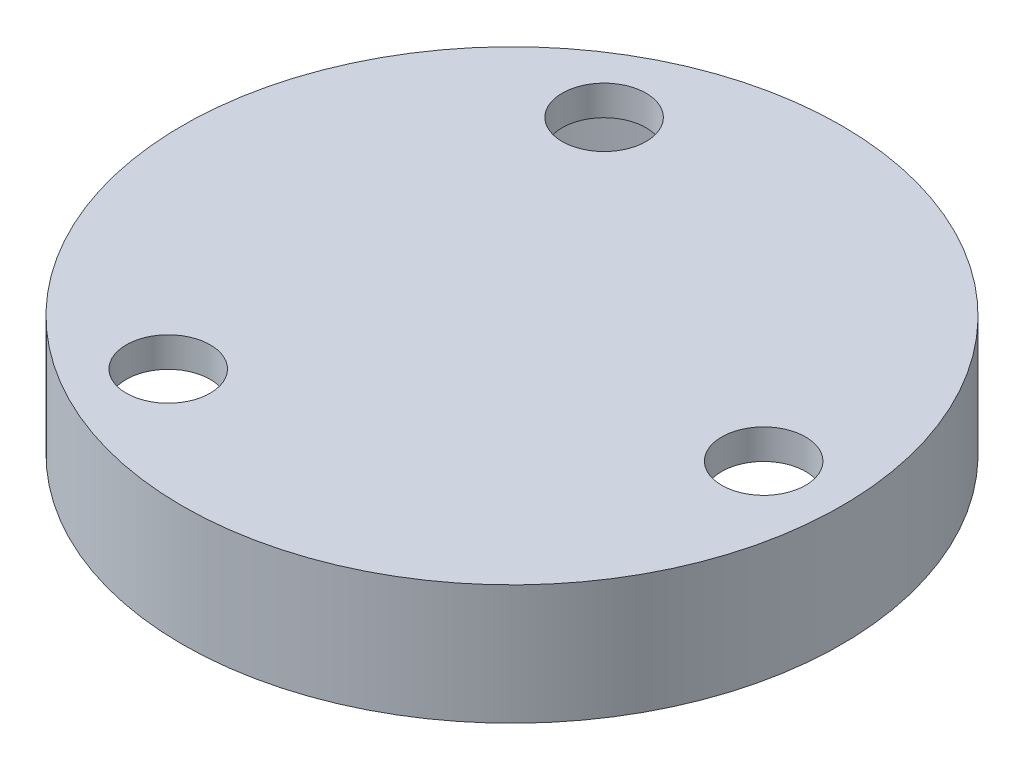
ISO-10303-21;
HEADER;
FILE_DESCRIPTION(('STEP AP214'),'2;1');
FILE_NAME('part.step','',(''),(''),'','','');
FILE_SCHEMA(('AUTOMOTIVE_DESIGN { 1 0 10303 214 1 1 1 1 }'));
ENDSEC;
DATA;
#1=APPLICATION_CONTEXT('core data for automotive mechanical design processes');
#2=APPLICATION_PROTOCOL_DEFINITION('international standard','automotive_design',2000,#1);
#3=PRODUCT_CONTEXT('',#1,'mechanical');
#4=PRODUCT('Part','Part','',(#3));
#5=PRODUCT_RELATED_PRODUCT_CATEGORY('part','',(#4));
#6=PRODUCT_DEFINITION_FORMATION('','',#4);
#7=PRODUCT_DEFINITION_CONTEXT('part definition',#1,'design');
#8=PRODUCT_DEFINITION('design','',#6,#7);
#9=PRODUCT_DEFINITION_SHAPE('','',#8);
#10=(LENGTH_UNIT() NAMED_UNIT(*) SI_UNIT(.MILLI.,.METRE.));
#11=(NAMED_UNIT(*) PLANE_ANGLE_UNIT() SI_UNIT($,.RADIAN.));
#12=(NAMED_UNIT(*) SI_UNIT($,.STERADIAN.) SOLID_ANGLE_UNIT());
#13=UNCERTAINTY_MEASURE_WITH_UNIT(LENGTH_MEASURE(1.E-05),#10,'distance_accuracy_value','');
#14=(GEOMETRIC_REPRESENTATION_CONTEXT(3) GLOBAL_UNCERTAINTY_ASSIGNED_CONTEXT((#13)) GLOBAL_UNIT_ASSIGNED_CONTEXT((#10,
#11,#12)) REPRESENTATION_CONTEXT('',''));
#15=CARTESIAN_POINT('',(0.,0.,0.));
#16=DIRECTION('',(0.,0.,1.));
#17=DIRECTION('',(1.,0.,0.));
#18=AXIS2_PLACEMENT_3D('',#15,#16,#17);
#19=CARTESIAN_POINT('',(0.,10.,0.));
#20=DIRECTION('',(0.,-1.,0.));
#21=DIRECTION('',(0.,0.,-1.));
#22=AXIS2_PLACEMENT_3D('',#19,#20,#21);
#23=CYLINDRICAL_SURFACE('',#22,55.);
#24=CARTESIAN_POINT('',(0.,10.,0.));
#25=DIRECTION('',(0.,1.,0.));
#26=DIRECTION('',(0.,0.,1.));
#27=AXIS2_PLACEMENT_3D('',#24,#25,#26);
#28=CIRCLE('',#27,55.);
#29=CARTESIAN_POINT('',(0.,10.,55.));
#30=VERTEX_POINT('',#29);
#31=EDGE_CURVE('E10',#30,#30,#28,.T.);
#32=ORIENTED_EDGE('',*,*,#31,.F.);
#33=EDGE_LOOP('',(#32));
#34=FACE_BOUND('',#33,.T.);
#35=CARTESIAN_POINT('',(0.,-10.,0.));
#36=DIRECTION('',(0.,1.,0.));
#37=DIRECTION('',(0.,0.,1.));
#38=AXIS2_PLACEMENT_3D('',#35,#36,#37);
#39=CIRCLE('',#38,55.);
#40=CARTESIAN_POINT('',(0.,-10.,55.));
#41=VERTEX_POINT('',#40);
#42=EDGE_CURVE('E44',#41,#41,#39,.T.);
#43=ORIENTED_EDGE('',*,*,#42,.T.);
#44=EDGE_LOOP('',(#43));
#45=FACE_BOUND('',#44,.T.);
#46=ADVANCED_FACE('F37',(#34,#45),#23,.T.);
#47=CARTESIAN_POINT('',(0.,10.,0.));
#48=DIRECTION('',(0.,1.,0.));
#49=DIRECTION('',(0.,0.,1.));
#50=AXIS2_PLACEMENT_3D('',#47,#48,#49);
#51=PLANE('',#50);
#52=CARTESIAN_POINT('',(-21.,10.,-36.3730669589464));
#53=DIRECTION('',(0.,1.,0.));
#54=DIRECTION('',(0.,0.,1.));
#55=AXIS2_PLACEMENT_3D('',#52,#53,#54);
#56=CIRCLE('',#55,7.);
#57=CARTESIAN_POINT('',(-21.,10.,-29.3730669589464));
#58=VERTEX_POINT('',#57);
#59=EDGE_CURVE('E58',#58,#58,#56,.T.);
#60=ORIENTED_EDGE('',*,*,#59,.F.);
#61=EDGE_LOOP('',(#60));
#62=FACE_BOUND('',#61,.T.);
#63=CARTESIAN_POINT('',(42.,10.,0.));
#64=DIRECTION('',(0.,1.,0.));
#65=DIRECTION('',(0.,0.,1.));
#66=AXIS2_PLACEMENT_3D('',#63,#64,#65);
#67=CIRCLE('',#66,7.);
#68=CARTESIAN_POINT('',(42.,10.,7.));
#69=VERTEX_POINT('',#68);
#70=EDGE_CURVE('E75',#69,#69,#67,.T.);
#71=ORIENTED_EDGE('',*,*,#70,.F.);
#72=EDGE_LOOP('',(#71));
#73=FACE_BOUND('',#72,.T.);
#74=CARTESIAN_POINT('',(-21.,10.,36.3730669589464));
#75=DIRECTION('',(0.,1.,0.));
#76=DIRECTION('',(0.,0.,1.));
#77=AXIS2_PLACEMENT_3D('',#74,#75,#76);
#78=CIRCLE('',#77,7.00000000000001);
#79=CARTESIAN_POINT('',(-21.,10.,43.3730669589464));
#80=VERTEX_POINT('',#79);
#81=EDGE_CURVE('E72',#80,#80,#78,.T.);
#82=ORIENTED_EDGE('',*,*,#81,.F.);
#83=EDGE_LOOP('',(#82));
#84=FACE_BOUND('',#83,.T.);
#85=ORIENTED_EDGE('',*,*,#31,.T.);
#86=EDGE_LOOP('',(#85));
#87=FACE_BOUND('',#86,.T.);
#88=ADVANCED_FACE('F84',(#62,#73,#84,#87),#51,.T.);
#89=CARTESIAN_POINT('',(0.,-10.,0.));
#90=DIRECTION('',(0.,1.,0.));
#91=DIRECTION('',(0.,0.,1.));
#92=AXIS2_PLACEMENT_3D('',#89,#90,#91);
#93=PLANE('',#92);
#94=CARTESIAN_POINT('',(0.,-10.,0.));
#95=DIRECTION('',(0.,1.,0.));
#96=DIRECTION('',(0.,0.,1.));
#97=AXIS2_PLACEMENT_3D('',#94,#95,#96);
#98=CIRCLE('',#97,50.);
#99=CARTESIAN_POINT('',(0.,-10.,50.));
#100=VERTEX_POINT('',#99);
#101=EDGE_CURVE('E52',#100,#100,#98,.T.);
#102=ORIENTED_EDGE('',*,*,#101,.T.);
#103=EDGE_LOOP('',(#102));
#104=FACE_BOUND('',#103,.T.);
#105=ORIENTED_EDGE('',*,*,#42,.F.);
#106=EDGE_LOOP('',(#105));
#107=FACE_BOUND('',#106,.T.);
#108=ADVANCED_FACE('F87',(#104,#107),#93,.F.);
#109=CARTESIAN_POINT('',(0.,10.,0.));
#110=DIRECTION('',(0.,-1.,0.));
#111=DIRECTION('',(0.,0.,-1.));
#112=AXIS2_PLACEMENT_3D('',#109,#110,#111);
#113=CYLINDRICAL_SURFACE('',#112,50.);
#114=CARTESIAN_POINT('',(0.,5.,0.));
#115=DIRECTION('',(0.,1.,0.));
#116=DIRECTION('',(0.,0.,1.));
#117=AXIS2_PLACEMENT_3D('',#114,#115,#116);
#118=CIRCLE('',#117,50.);
#119=CARTESIAN_POINT('',(0.,5.,50.));
#120=VERTEX_POINT('',#119);
#121=EDGE_CURVE('E49',#120,#120,#118,.T.);
#122=ORIENTED_EDGE('',*,*,#121,.T.);
#123=EDGE_LOOP('',(#122));
#124=FACE_BOUND('',#123,.T.);
#125=ORIENTED_EDGE('',*,*,#101,.F.);
#126=EDGE_LOOP('',(#125));
#127=FACE_BOUND('',#126,.T.);
#128=ADVANCED_FACE('F103',(#124,#127),#113,.F.);
#129=CARTESIAN_POINT('',(0.,5.,0.));
#130=DIRECTION('',(0.,1.,0.));
#131=DIRECTION('',(0.,0.,1.));
#132=AXIS2_PLACEMENT_3D('',#129,#130,#131);
#133=PLANE('',#132);
#134=CARTESIAN_POINT('',(-21.,5.,-36.3730669589464));
#135=DIRECTION('',(0.,1.,0.));
#136=DIRECTION('',(0.,0.,1.));
#137=AXIS2_PLACEMENT_3D('',#134,#135,#136);
#138=CIRCLE('',#137,7.);
#139=CARTESIAN_POINT('',(-21.,5.,-29.3730669589464));
#140=VERTEX_POINT('',#139);
#141=EDGE_CURVE('E40',#140,#140,#138,.T.);
#142=ORIENTED_EDGE('',*,*,#141,.T.);
#143=EDGE_LOOP('',(#142));
#144=FACE_BOUND('',#143,.T.);
#145=CARTESIAN_POINT('',(42.,5.,0.));
#146=DIRECTION('',(0.,1.,0.));
#147=DIRECTION('',(0.,0.,1.));
#148=AXIS2_PLACEMENT_3D('',#145,#146,#147);
#149=CIRCLE('',#148,7.);
#150=CARTESIAN_POINT('',(42.,5.,7.));
#151=VERTEX_POINT('',#150);
#152=EDGE_CURVE('E57',#151,#151,#149,.T.);
#153=ORIENTED_EDGE('',*,*,#152,.T.);
#154=EDGE_LOOP('',(#153));
#155=FACE_BOUND('',#154,.T.);
#156=CARTESIAN_POINT('',(-21.,5.,36.3730669589464));
#157=DIRECTION('',(0.,1.,0.));
#158=DIRECTION('',(0.,0.,1.));
#159=AXIS2_PLACEMENT_3D('',#156,#157,#158);
#160=CIRCLE('',#159,7.00000000000001);
#161=CARTESIAN_POINT('',(-21.,5.,43.3730669589464));
#162=VERTEX_POINT('',#161);
#163=EDGE_CURVE('E55',#162,#162,#160,.T.);
#164=ORIENTED_EDGE('',*,*,#163,.T.);
#165=EDGE_LOOP('',(#164));
#166=FACE_BOUND('',#165,.T.);
#167=ORIENTED_EDGE('',*,*,#121,.F.);
#168=EDGE_LOOP('',(#167));
#169=FACE_BOUND('',#168,.T.);
#170=ADVANCED_FACE('F97',(#144,#155,#166,#169),#133,.F.);
#171=CARTESIAN_POINT('',(-21.,-10.,36.3730669589464));
#172=DIRECTION('',(0.,1.,0.));
#173=DIRECTION('',(0.,0.,1.));
#174=AXIS2_PLACEMENT_3D('',#171,#172,#173);
#175=CYLINDRICAL_SURFACE('',#174,7.00000000000001);
#176=ORIENTED_EDGE('',*,*,#81,.T.);
#177=EDGE_LOOP('',(#176));
#178=FACE_BOUND('',#177,.T.);
#179=ORIENTED_EDGE('',*,*,#163,.F.);
#180=EDGE_LOOP('',(#179));
#181=FACE_BOUND('',#180,.T.);
#182=ADVANCED_FACE('F93',(#178,#181),#175,.F.);
#183=CARTESIAN_POINT('',(42.,-10.,0.));
#184=DIRECTION('',(0.,1.,0.));
#185=DIRECTION('',(0.,0.,1.));
#186=AXIS2_PLACEMENT_3D('',#183,#184,#185);
#187=CYLINDRICAL_SURFACE('',#186,7.);
#188=ORIENTED_EDGE('',*,*,#70,.T.);
#189=EDGE_LOOP('',(#188));
#190=FACE_BOUND('',#189,.T.);
#191=ORIENTED_EDGE('',*,*,#152,.F.);
#192=EDGE_LOOP('',(#191));
#193=FACE_BOUND('',#192,.T.);
#194=ADVANCED_FACE('F96',(#190,#193),#187,.F.);
#195=CARTESIAN_POINT('',(-21.,-10.,-36.3730669589464));
#196=DIRECTION('',(0.,1.,0.));
#197=DIRECTION('',(0.,0.,1.));
#198=AXIS2_PLACEMENT_3D('',#195,#196,#197);
#199=CYLINDRICAL_SURFACE('',#198,7.);
#200=ORIENTED_EDGE('',*,*,#59,.T.);
#201=EDGE_LOOP('',(#200));
#202=FACE_BOUND('',#201,.T.);
#203=ORIENTED_EDGE('',*,*,#141,.F.);
#204=EDGE_LOOP('',(#203));
#205=FACE_BOUND('',#204,.T.);
#206=ADVANCED_FACE('F81',(#202,#205),#199,.F.);
#207=CLOSED_SHELL('',(#46,#88,#108,#128,#170,#182,#194,#206));
#208=MANIFOLD_SOLID_BREP('B2',#207);
#209=ADVANCED_BREP_SHAPE_REPRESENTATION('',(#18,#208),#14);
#210=SHAPE_DEFINITION_REPRESENTATION(#9,#209);
ENDSEC;
END-ISO-10303-21;
